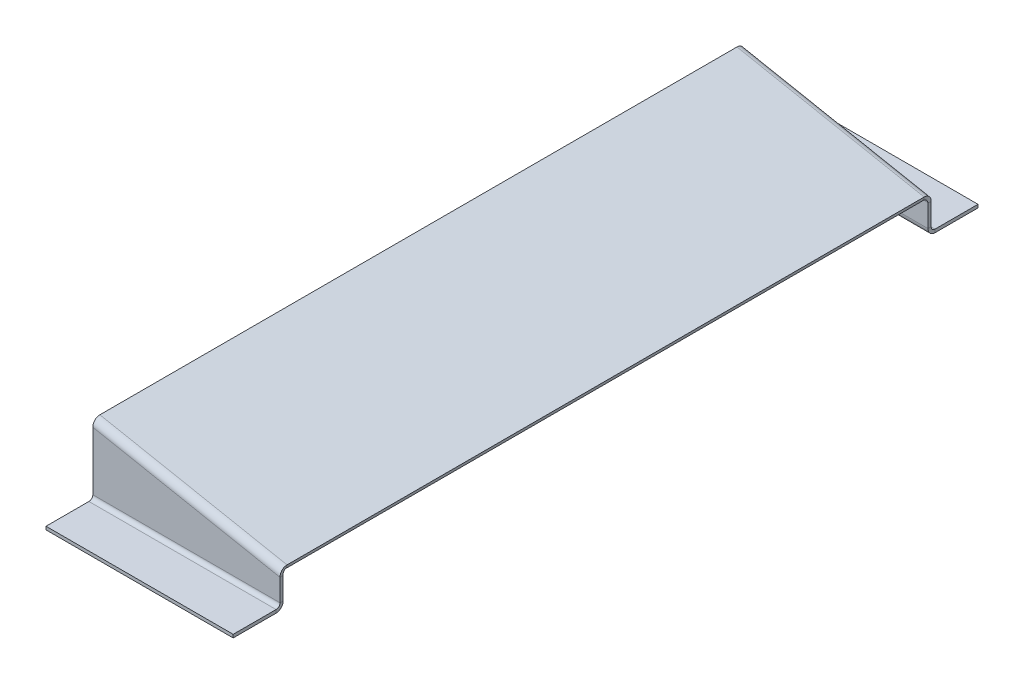
ISO-10303-21;
HEADER;
FILE_DESCRIPTION(('STEP AP214'),'2;1');
FILE_NAME('part.step','',(''),(''),'','','');
FILE_SCHEMA(('AUTOMOTIVE_DESIGN { 1 0 10303 214 1 1 1 1 }'));
ENDSEC;
DATA;
#1=APPLICATION_CONTEXT('core data for automotive mechanical design processes');
#2=APPLICATION_PROTOCOL_DEFINITION('international standard','automotive_design',2000,#1);
#3=PRODUCT_CONTEXT('',#1,'mechanical');
#4=PRODUCT('Part','Part','',(#3));
#5=PRODUCT_RELATED_PRODUCT_CATEGORY('part','',(#4));
#6=PRODUCT_DEFINITION_FORMATION('','',#4);
#7=PRODUCT_DEFINITION_CONTEXT('part definition',#1,'design');
#8=PRODUCT_DEFINITION('design','',#6,#7);
#9=PRODUCT_DEFINITION_SHAPE('','',#8);
#10=(LENGTH_UNIT() NAMED_UNIT(*) SI_UNIT(.MILLI.,.METRE.));
#11=(NAMED_UNIT(*) PLANE_ANGLE_UNIT() SI_UNIT($,.RADIAN.));
#12=(NAMED_UNIT(*) SI_UNIT($,.STERADIAN.) SOLID_ANGLE_UNIT());
#13=UNCERTAINTY_MEASURE_WITH_UNIT(LENGTH_MEASURE(1.E-05),#10,'distance_accuracy_value','');
#14=(GEOMETRIC_REPRESENTATION_CONTEXT(3) GLOBAL_UNCERTAINTY_ASSIGNED_CONTEXT((#13)) GLOBAL_UNIT_ASSIGNED_CONTEXT((#10,
#11,#12)) REPRESENTATION_CONTEXT('',''));
#15=CARTESIAN_POINT('',(0.,0.,0.));
#16=DIRECTION('',(0.,0.,1.));
#17=DIRECTION('',(1.,0.,0.));
#18=AXIS2_PLACEMENT_3D('',#15,#16,#17);
#19=CARTESIAN_POINT('',(-304.8,59.2471182251768,-265.1125));
#20=DIRECTION('',(-1.,0.,0.));
#21=DIRECTION('',(0.,-1.,0.));
#22=AXIS2_PLACEMENT_3D('',#19,#20,#21);
#23=PLANE('',#22);
#24=DIRECTION('',(0.,0.,-1.));
#25=VECTOR('',#24,1.);
#26=CARTESIAN_POINT('',(-304.8,5.7632600000001,-265.1125));
#27=LINE('',#26,#25);
#28=CARTESIAN_POINT('',(-304.8,5.76326000000009,-262.52424));
#29=VERTEX_POINT('',#28);
#30=CARTESIAN_POINT('',(-304.8,5.7632600000001,-265.1125));
#31=VERTEX_POINT('',#30);
#32=EDGE_CURVE('E11',#29,#31,#27,.T.);
#33=ORIENTED_EDGE('',*,*,#32,.F.);
#34=DIRECTION('',(0.,1.,0.));
#35=VECTOR('',#34,1.);
#36=CARTESIAN_POINT('',(-304.8,0.,-262.52424));
#37=LINE('',#36,#35);
#38=CARTESIAN_POINT('',(-304.8,53.3759890458092,-262.52424));
#39=VERTEX_POINT('',#38);
#40=EDGE_CURVE('E123',#39,#29,#37,.F.);
#41=ORIENTED_EDGE('',*,*,#40,.F.);
#42=DIRECTION('',(0.,0.,-1.));
#43=VECTOR('',#42,1.);
#44=CARTESIAN_POINT('',(-304.8,53.3759890458092,-265.1125));
#45=LINE('',#44,#43);
#46=CARTESIAN_POINT('',(-304.8,53.3759890458092,-265.1125));
#47=VERTEX_POINT('',#46);
#48=EDGE_CURVE('E47',#39,#47,#45,.T.);
#49=ORIENTED_EDGE('',*,*,#48,.T.);
#50=DIRECTION('',(0.,-1.,0.));
#51=VECTOR('',#50,1.);
#52=CARTESIAN_POINT('',(-304.8,59.2471182251768,-265.1125));
#53=LINE('',#52,#51);
#54=EDGE_CURVE('E126',#47,#31,#53,.T.);
#55=ORIENTED_EDGE('',*,*,#54,.T.);
#56=EDGE_LOOP('',(#33,#41,#49,#55));
#57=FACE_BOUND('',#56,.T.);
#58=ADVANCED_FACE('F37',(#57),#23,.T.);
#59=CARTESIAN_POINT('',(-304.8,47.5048598664417,-259.34924));
#60=CARTESIAN_POINT('',(-304.635378903209,48.3517619910518,-259.34924));
#61=CARTESIAN_POINT('',(-304.470757806418,49.1986641156618,-259.34924));
#62=CARTESIAN_POINT('',(-304.306136709627,50.0455662402719,-259.34924));
#63=CARTESIAN_POINT('',(-304.8,47.5048598664417,-270.87576));
#64=CARTESIAN_POINT('',(-304.635378903209,48.3517619910518,-269.150253333333));
#65=CARTESIAN_POINT('',(-304.470757806418,49.1986641156619,-267.424746666667));
#66=CARTESIAN_POINT('',(-304.306136709627,50.0455662402719,-265.69924));
#67=CARTESIAN_POINT('',(-304.8,59.2471182251768,-270.87576));
#68=CARTESIAN_POINT('',(-304.964621096791,58.4002161005668,-269.150253333333));
#69=CARTESIAN_POINT('',(-305.129242193582,57.5533139759567,-267.424746666667));
#70=CARTESIAN_POINT('',(-305.293863290373,56.7064118513466,-265.69924));
#71=CARTESIAN_POINT('',(-304.8,59.2471182251768,-259.34924));
#72=CARTESIAN_POINT('',(-304.964621096791,58.4002161005668,-259.34924));
#73=CARTESIAN_POINT('',(-305.129242193582,57.5533139759567,-259.34924));
#74=CARTESIAN_POINT('',(-305.293863290373,56.7064118513466,-259.34924));
#75=CARTESIAN_POINT('',(-304.8,59.2471182251768,-247.82272));
#76=CARTESIAN_POINT('',(-304.964621096791,58.4002161005668,-249.548226666667));
#77=CARTESIAN_POINT('',(-305.129242193582,57.5533139759567,-251.273733333333));
#78=CARTESIAN_POINT('',(-305.293863290373,56.7064118513466,-252.99924));
#79=CARTESIAN_POINT('',(-304.8,47.5048598664417,-247.82272));
#80=CARTESIAN_POINT('',(-304.635378903209,48.3517619910518,-249.548226666667));
#81=CARTESIAN_POINT('',(-304.470757806418,49.1986641156619,-251.273733333333));
#82=CARTESIAN_POINT('',(-304.306136709627,50.0455662402719,-252.99924));
#83=CARTESIAN_POINT('',(-304.8,47.5048598664417,-259.34924));
#84=CARTESIAN_POINT('',(-304.635378903209,48.3517619910518,-259.34924));
#85=CARTESIAN_POINT('',(-304.470757806418,49.1986641156618,-259.34924));
#86=CARTESIAN_POINT('',(-304.306136709627,50.0455662402719,-259.34924));
#87=(BOUNDED_SURFACE() B_SPLINE_SURFACE(3,3,((#59,#60,#61,#62),(#63,#64,#65,#66),(#67,#68,#69,
#70),(#71,#72,#73,#74),(#75,#76,#77,#78),(#79,#80,#81,#82),(#83,#84,#85,#86)),.UNSPECIFIED.,.T.,
.F.,.F.) B_SPLINE_SURFACE_WITH_KNOTS((4,3,4),(4,4),(0.,0.5,1.),(0.,1.),
.UNSPECIFIED.) GEOMETRIC_REPRESENTATION_ITEM() RATIONAL_B_SPLINE_SURFACE(((1.,1.,1.,1.),
(0.333333333333333,0.333333333333333,0.333333333333333,0.333333333333333),(0.333333333333333,
0.333333333333333,0.333333333333333,0.333333333333333),(1.,1.,1.,1.),(0.333333333333333,
0.333333333333333,0.333333333333333,0.333333333333333),(0.333333333333333,0.333333333333333,
0.333333333333333,0.333333333333333),(1.,1.,1.,1.))) REPRESENTATION_ITEM('') SURFACE());
#88=CARTESIAN_POINT('',(-304.8,53.3759890458093,-259.34924));
#89=DIRECTION('',(-0.989183331615166,-0.146684479256399,0.));
#90=DIRECTION('',(0.146684479256399,-0.989183331615166,0.));
#91=AXIS2_PLACEMENT_3D('',#88,#89,#90);
#92=ELLIPSE('',#91,3.36684080604081,3.175);
#93=CARTESIAN_POINT('',(-305.293863290373,56.7064118513466,-259.34924));
#94=VERTEX_POINT('',#93);
#95=EDGE_CURVE('E164',#39,#94,#92,.F.);
#96=DIRECTION('',(0.190808995376545,0.981627183447664,0.));
#97=VECTOR('',#96,1.);
#98=CARTESIAN_POINT('',(-304.8,59.2471182251768,-259.34924));
#99=LINE('',#98,#97);
#100=CARTESIAN_POINT('',(-304.8,59.2471182251768,-259.34924));
#101=VERTEX_POINT('',#100);
#102=EDGE_CURVE('E213',#94,#101,#99,.T.);
#103=CARTESIAN_POINT('',(-304.8,53.3759890458093,-259.34924));
#104=DIRECTION('',(-1.,0.,0.));
#105=DIRECTION('',(0.,-1.,0.));
#106=AXIS2_PLACEMENT_3D('',#103,#104,#105);
#107=ELLIPSE('',#106,5.87112917936759,5.76326);
#108=EDGE_CURVE('E235',#47,#101,#107,.F.);
#109=ORIENTED_EDGE('',*,*,#48,.F.);
#110=ORIENTED_EDGE('',*,*,#95,.T.);
#111=ORIENTED_EDGE('',*,*,#102,.T.);
#112=ORIENTED_EDGE('',*,*,#108,.F.);
#113=EDGE_LOOP('',(#109,#110,#111,#112));
#114=FACE_BOUND('',#113,.T.);
#115=ADVANCED_FACE('F236',(#114),#87,.F.);
#116=CARTESIAN_POINT('',(-304.8,59.2471182251768,265.1125));
#117=DIRECTION('',(-0.981627183447664,0.190808995376545,0.));
#118=DIRECTION('',(0.,0.,-1.));
#119=AXIS2_PLACEMENT_3D('',#116,#117,#118);
#120=PLANE('',#119);
#121=ORIENTED_EDGE('',*,*,#102,.F.);
#122=DIRECTION('',(0.,0.,1.));
#123=VECTOR('',#122,1.);
#124=CARTESIAN_POINT('',(-305.293863290373,56.7064118513466,0.));
#125=LINE('',#124,#123);
#126=CARTESIAN_POINT('',(-305.293863290373,56.7064118513465,259.34924));
#127=VERTEX_POINT('',#126);
#128=EDGE_CURVE('E315',#127,#94,#125,.F.);
#129=ORIENTED_EDGE('',*,*,#128,.F.);
#130=DIRECTION('',(0.190808995376562,0.981627183447661,0.));
#131=VECTOR('',#130,1.);
#132=CARTESIAN_POINT('',(-304.8,59.2471182251768,259.34924));
#133=LINE('',#132,#131);
#134=CARTESIAN_POINT('',(-304.8,59.2471182251768,259.34924));
#135=VERTEX_POINT('',#134);
#136=EDGE_CURVE('E210',#127,#135,#133,.T.);
#137=ORIENTED_EDGE('',*,*,#136,.T.);
#138=DIRECTION('',(0.,0.,-1.));
#139=VECTOR('',#138,1.);
#140=CARTESIAN_POINT('',(-304.8,59.2471182251768,265.1125));
#141=LINE('',#140,#139);
#142=EDGE_CURVE('E352',#135,#101,#141,.T.);
#143=ORIENTED_EDGE('',*,*,#142,.T.);
#144=EDGE_LOOP('',(#121,#129,#137,#143));
#145=FACE_BOUND('',#144,.T.);
#146=ADVANCED_FACE('F349',(#145),#120,.T.);
#147=CARTESIAN_POINT('',(-304.8,47.5048598664416,259.34924));
#148=CARTESIAN_POINT('',(-304.635378903209,48.3517619910517,259.34924));
#149=CARTESIAN_POINT('',(-304.470757806418,49.1986641156618,259.34924));
#150=CARTESIAN_POINT('',(-304.306136709627,50.0455662402718,259.34924));
#151=CARTESIAN_POINT('',(-304.8,47.5048598664416,247.82272));
#152=CARTESIAN_POINT('',(-304.635378903209,48.3517619910517,249.548226666667));
#153=CARTESIAN_POINT('',(-304.470757806418,49.1986641156618,251.273733333333));
#154=CARTESIAN_POINT('',(-304.306136709627,50.0455662402718,252.99924));
#155=CARTESIAN_POINT('',(-304.8,59.2471182251768,247.82272));
#156=CARTESIAN_POINT('',(-304.964621096791,58.4002161005667,249.548226666667));
#157=CARTESIAN_POINT('',(-305.129242193582,57.5533139759566,251.273733333333));
#158=CARTESIAN_POINT('',(-305.293863290373,56.7064118513465,252.99924));
#159=CARTESIAN_POINT('',(-304.8,59.2471182251768,259.34924));
#160=CARTESIAN_POINT('',(-304.964621096791,58.4002161005667,259.34924));
#161=CARTESIAN_POINT('',(-305.129242193582,57.5533139759566,259.34924));
#162=CARTESIAN_POINT('',(-305.293863290373,56.7064118513465,259.34924));
#163=CARTESIAN_POINT('',(-304.8,59.2471182251768,270.87576));
#164=CARTESIAN_POINT('',(-304.964621096791,58.4002161005667,269.150253333333));
#165=CARTESIAN_POINT('',(-305.129242193582,57.5533139759566,267.424746666667));
#166=CARTESIAN_POINT('',(-305.293863290373,56.7064118513465,265.69924));
#167=CARTESIAN_POINT('',(-304.8,47.5048598664416,270.87576));
#168=CARTESIAN_POINT('',(-304.635378903209,48.3517619910517,269.150253333333));
#169=CARTESIAN_POINT('',(-304.470757806418,49.1986641156618,267.424746666667));
#170=CARTESIAN_POINT('',(-304.306136709627,50.0455662402718,265.69924));
#171=CARTESIAN_POINT('',(-304.8,47.5048598664416,259.34924));
#172=CARTESIAN_POINT('',(-304.635378903209,48.3517619910517,259.34924));
#173=CARTESIAN_POINT('',(-304.470757806418,49.1986641156618,259.34924));
#174=CARTESIAN_POINT('',(-304.306136709627,50.0455662402718,259.34924));
#175=(BOUNDED_SURFACE() B_SPLINE_SURFACE(3,3,((#147,#148,#149,#150),(#151,#152,#153,#154),(#155,
#156,#157,#158),(#159,#160,#161,#162),(#163,#164,#165,#166),(#167,#168,#169,#170),(#171,#172,
#173,#174)),.UNSPECIFIED.,.T.,.F.,.F.) B_SPLINE_SURFACE_WITH_KNOTS((4,3,4),(4,4),(0.,0.5,1.),
(0.,1.),.UNSPECIFIED.) GEOMETRIC_REPRESENTATION_ITEM() RATIONAL_B_SPLINE_SURFACE(((1.,1.,1.,1.),
(0.333333333333333,0.333333333333333,0.333333333333333,0.333333333333333),(0.333333333333333,
0.333333333333333,0.333333333333333,0.333333333333333),(1.,1.,1.,1.),(0.333333333333333,
0.333333333333333,0.333333333333333,0.333333333333333),(0.333333333333333,0.333333333333333,
0.333333333333333,0.333333333333333),(1.,1.,1.,1.))) REPRESENTATION_ITEM('') SURFACE());
#176=CARTESIAN_POINT('',(-304.8,53.3759890458092,259.34924));
#177=DIRECTION('',(-0.989183331615166,-0.1466844792564,0.));
#178=DIRECTION('',(0.1466844792564,-0.989183331615166,0.));
#179=AXIS2_PLACEMENT_3D('',#176,#177,#178);
#180=ELLIPSE('',#179,3.36684080604081,3.175);
#181=CARTESIAN_POINT('',(-304.8,53.3759890458092,262.52424));
#182=VERTEX_POINT('',#181);
#183=EDGE_CURVE('E312',#127,#182,#180,.F.);
#184=DIRECTION('',(0.,0.,1.));
#185=VECTOR('',#184,1.);
#186=CARTESIAN_POINT('',(-304.8,53.3759890458092,265.1125));
#187=LINE('',#186,#185);
#188=CARTESIAN_POINT('',(-304.8,53.3759890458092,265.1125));
#189=VERTEX_POINT('',#188);
#190=EDGE_CURVE('E207',#182,#189,#187,.T.);
#191=CARTESIAN_POINT('',(-304.8,53.3759890458092,259.34924));
#192=DIRECTION('',(-1.,0.,0.));
#193=DIRECTION('',(0.,-1.,0.));
#194=AXIS2_PLACEMENT_3D('',#191,#192,#193);
#195=ELLIPSE('',#194,5.87112917936759,5.76326);
#196=EDGE_CURVE('E258',#135,#189,#195,.F.);
#197=ORIENTED_EDGE('',*,*,#136,.F.);
#198=ORIENTED_EDGE('',*,*,#183,.T.);
#199=ORIENTED_EDGE('',*,*,#190,.T.);
#200=ORIENTED_EDGE('',*,*,#196,.F.);
#201=EDGE_LOOP('',(#197,#198,#199,#200));
#202=FACE_BOUND('',#201,.T.);
#203=ADVANCED_FACE('F484',(#202),#175,.F.);
#204=CARTESIAN_POINT('',(-304.8,2.58826,265.1125));
#205=DIRECTION('',(-1.,0.,0.));
#206=DIRECTION('',(0.,1.,0.));
#207=AXIS2_PLACEMENT_3D('',#204,#205,#206);
#208=PLANE('',#207);
#209=ORIENTED_EDGE('',*,*,#190,.F.);
#210=DIRECTION('',(0.,1.,0.));
#211=VECTOR('',#210,1.);
#212=CARTESIAN_POINT('',(-304.8,0.,262.52424));
#213=LINE('',#212,#211);
#214=CARTESIAN_POINT('',(-304.8,5.76326,262.52424));
#215=VERTEX_POINT('',#214);
#216=EDGE_CURVE('E323',#215,#182,#213,.T.);
#217=ORIENTED_EDGE('',*,*,#216,.F.);
#218=DIRECTION('',(0.,0.,1.));
#219=VECTOR('',#218,1.);
#220=CARTESIAN_POINT('',(-304.8,5.76326,265.1125));
#221=LINE('',#220,#219);
#222=CARTESIAN_POINT('',(-304.8,5.76326,265.1125));
#223=VERTEX_POINT('',#222);
#224=EDGE_CURVE('E204',#215,#223,#221,.T.);
#225=ORIENTED_EDGE('',*,*,#224,.T.);
#226=DIRECTION('',(0.,1.,0.));
#227=VECTOR('',#226,1.);
#228=CARTESIAN_POINT('',(-304.8,2.58826,265.1125));
#229=LINE('',#228,#227);
#230=EDGE_CURVE('E378',#223,#189,#229,.T.);
#231=ORIENTED_EDGE('',*,*,#230,.T.);
#232=EDGE_LOOP('',(#209,#217,#225,#231));
#233=FACE_BOUND('',#232,.T.);
#234=ADVANCED_FACE('F377',(#233),#208,.T.);
#235=CARTESIAN_POINT('',(-304.8,5.76326,268.2875));
#236=DIRECTION('',(-1.,0.,0.));
#237=DIRECTION('',(0.,0.,1.));
#238=AXIS2_PLACEMENT_3D('',#235,#236,#237);
#239=PLANE('',#238);
#240=ORIENTED_EDGE('',*,*,#224,.F.);
#241=CARTESIAN_POINT('',(-304.8,5.76326,268.2875));
#242=DIRECTION('',(-1.,0.,0.));
#243=DIRECTION('',(0.,0.,1.));
#244=AXIS2_PLACEMENT_3D('',#241,#242,#243);
#245=CIRCLE('',#244,5.76326);
#246=CARTESIAN_POINT('',(-304.8,0.,268.2875));
#247=VERTEX_POINT('',#246);
#248=EDGE_CURVE('E319',#215,#247,#245,.T.);
#249=ORIENTED_EDGE('',*,*,#248,.T.);
#250=DIRECTION('',(0.,1.,0.));
#251=VECTOR('',#250,1.);
#252=CARTESIAN_POINT('',(-304.8,2.58826,268.2875));
#253=LINE('',#252,#251);
#254=CARTESIAN_POINT('',(-304.8,2.58826,268.2875));
#255=VERTEX_POINT('',#254);
#256=EDGE_CURVE('E202',#247,#255,#253,.T.);
#257=ORIENTED_EDGE('',*,*,#256,.T.);
#258=CARTESIAN_POINT('',(-304.8,5.76326,268.2875));
#259=DIRECTION('',(1.,0.,0.));
#260=DIRECTION('',(0.,0.,-1.));
#261=AXIS2_PLACEMENT_3D('',#258,#259,#260);
#262=CIRCLE('',#261,3.175);
#263=EDGE_CURVE('E269',#223,#255,#262,.F.);
#264=ORIENTED_EDGE('',*,*,#263,.F.);
#265=EDGE_LOOP('',(#240,#249,#257,#264));
#266=FACE_BOUND('',#265,.T.);
#267=ADVANCED_FACE('F389',(#266),#239,.T.);
#268=CARTESIAN_POINT('',(-304.8,2.58826,303.2125));
#269=DIRECTION('',(-1.,0.,0.));
#270=DIRECTION('',(0.,0.,-1.));
#271=AXIS2_PLACEMENT_3D('',#268,#269,#270);
#272=PLANE('',#271);
#273=ORIENTED_EDGE('',*,*,#256,.F.);
#274=DIRECTION('',(0.,0.,-1.));
#275=VECTOR('',#274,1.);
#276=CARTESIAN_POINT('',(-304.8,0.,0.));
#277=LINE('',#276,#275);
#278=CARTESIAN_POINT('',(-304.8,0.,303.2125));
#279=VERTEX_POINT('',#278);
#280=EDGE_CURVE('E159',#279,#247,#277,.T.);
#281=ORIENTED_EDGE('',*,*,#280,.F.);
#282=DIRECTION('',(0.,1.,0.));
#283=VECTOR('',#282,1.);
#284=CARTESIAN_POINT('',(-304.8,2.58826,303.2125));
#285=LINE('',#284,#283);
#286=CARTESIAN_POINT('',(-304.8,2.58826,303.2125));
#287=VERTEX_POINT('',#286);
#288=EDGE_CURVE('E199',#279,#287,#285,.T.);
#289=ORIENTED_EDGE('',*,*,#288,.T.);
#290=DIRECTION('',(0.,0.,-1.));
#291=VECTOR('',#290,1.);
#292=CARTESIAN_POINT('',(-304.8,2.58826,303.2125));
#293=LINE('',#292,#291);
#294=EDGE_CURVE('E403',#287,#255,#293,.T.);
#295=ORIENTED_EDGE('',*,*,#294,.T.);
#296=EDGE_LOOP('',(#273,#281,#289,#295));
#297=FACE_BOUND('',#296,.T.);
#298=ADVANCED_FACE('F499',(#297),#272,.T.);
#299=CARTESIAN_POINT('',(-304.8,2.58826,303.2125));
#300=DIRECTION('',(0.,0.,-1.));
#301=DIRECTION('',(1.,0.,0.));
#302=AXIS2_PLACEMENT_3D('',#299,#300,#301);
#303=PLANE('',#302);
#304=ORIENTED_EDGE('',*,*,#288,.F.);
#305=DIRECTION('',(1.,0.,0.));
#306=VECTOR('',#305,1.);
#307=CARTESIAN_POINT('',(0.,0.,303.2125));
#308=LINE('',#307,#306);
#309=CARTESIAN_POINT('',(-152.4,0.,303.2125));
#310=VERTEX_POINT('',#309);
#311=EDGE_CURVE('E162',#279,#310,#308,.T.);
#312=ORIENTED_EDGE('',*,*,#311,.T.);
#313=DIRECTION('',(0.,1.,0.));
#314=VECTOR('',#313,1.);
#315=CARTESIAN_POINT('',(-152.4,2.58826,303.2125));
#316=LINE('',#315,#314);
#317=CARTESIAN_POINT('',(-152.4,2.58826,303.2125));
#318=VERTEX_POINT('',#317);
#319=EDGE_CURVE('E196',#310,#318,#316,.T.);
#320=ORIENTED_EDGE('',*,*,#319,.T.);
#321=DIRECTION('',(1.,0.,0.));
#322=VECTOR('',#321,1.);
#323=CARTESIAN_POINT('',(-304.8,2.58826,303.2125));
#324=LINE('',#323,#322);
#325=EDGE_CURVE('E405',#287,#318,#324,.T.);
#326=ORIENTED_EDGE('',*,*,#325,.F.);
#327=EDGE_LOOP('',(#304,#312,#320,#326));
#328=FACE_BOUND('',#327,.T.);
#329=ADVANCED_FACE('F502',(#328),#303,.F.);
#330=CARTESIAN_POINT('',(-152.4,2.58826,303.2125));
#331=DIRECTION('',(-1.,0.,0.));
#332=DIRECTION('',(0.,0.,-1.));
#333=AXIS2_PLACEMENT_3D('',#330,#331,#332);
#334=PLANE('',#333);
#335=ORIENTED_EDGE('',*,*,#319,.F.);
#336=DIRECTION('',(0.,0.,-1.));
#337=VECTOR('',#336,1.);
#338=CARTESIAN_POINT('',(-152.4,0.,0.));
#339=LINE('',#338,#337);
#340=CARTESIAN_POINT('',(-152.4,0.,268.2875));
#341=VERTEX_POINT('',#340);
#342=EDGE_CURVE('E327',#310,#341,#339,.T.);
#343=ORIENTED_EDGE('',*,*,#342,.T.);
#344=DIRECTION('',(0.,1.,0.));
#345=VECTOR('',#344,1.);
#346=CARTESIAN_POINT('',(-152.4,2.58826,268.2875));
#347=LINE('',#346,#345);
#348=CARTESIAN_POINT('',(-152.4,2.58826,268.2875));
#349=VERTEX_POINT('',#348);
#350=EDGE_CURVE('E55',#341,#349,#347,.T.);
#351=ORIENTED_EDGE('',*,*,#350,.T.);
#352=DIRECTION('',(0.,0.,-1.));
#353=VECTOR('',#352,1.);
#354=CARTESIAN_POINT('',(-152.4,2.58826,303.2125));
#355=LINE('',#354,#353);
#356=EDGE_CURVE('E387',#318,#349,#355,.T.);
#357=ORIENTED_EDGE('',*,*,#356,.F.);
#358=EDGE_LOOP('',(#335,#343,#351,#357));
#359=FACE_BOUND('',#358,.T.);
#360=ADVANCED_FACE('F506',(#359),#334,.F.);
#361=CARTESIAN_POINT('',(-152.4,5.76326,268.2875));
#362=DIRECTION('',(1.,0.,0.));
#363=DIRECTION('',(0.,0.,-1.));
#364=AXIS2_PLACEMENT_3D('',#361,#362,#363);
#365=PLANE('',#364);
#366=ORIENTED_EDGE('',*,*,#350,.F.);
#367=CARTESIAN_POINT('',(-152.4,5.76326,268.2875));
#368=DIRECTION('',(-1.,0.,0.));
#369=DIRECTION('',(0.,0.,1.));
#370=AXIS2_PLACEMENT_3D('',#367,#368,#369);
#371=CIRCLE('',#370,5.76326);
#372=CARTESIAN_POINT('',(-152.4,5.76326,262.52424));
#373=VERTEX_POINT('',#372);
#374=EDGE_CURVE('E324',#341,#373,#371,.F.);
#375=ORIENTED_EDGE('',*,*,#374,.T.);
#376=DIRECTION('',(0.,0.,1.));
#377=VECTOR('',#376,1.);
#378=CARTESIAN_POINT('',(-152.4,5.76326,265.1125));
#379=LINE('',#378,#377);
#380=CARTESIAN_POINT('',(-152.4,5.76326,265.1125));
#381=VERTEX_POINT('',#380);
#382=EDGE_CURVE('E192',#373,#381,#379,.T.);
#383=ORIENTED_EDGE('',*,*,#382,.T.);
#384=CARTESIAN_POINT('',(-152.4,5.76326,268.2875));
#385=DIRECTION('',(-1.,0.,0.));
#386=DIRECTION('',(0.,0.,1.));
#387=AXIS2_PLACEMENT_3D('',#384,#385,#386);
#388=CIRCLE('',#387,3.175);
#389=EDGE_CURVE('E277',#349,#381,#388,.F.);
#390=ORIENTED_EDGE('',*,*,#389,.F.);
#391=EDGE_LOOP('',(#366,#375,#383,#390));
#392=FACE_BOUND('',#391,.T.);
#393=ADVANCED_FACE('F510',(#392),#365,.T.);
#394=CARTESIAN_POINT('',(-152.4,2.58826,265.1125));
#395=DIRECTION('',(-1.,0.,0.));
#396=DIRECTION('',(0.,1.,0.));
#397=AXIS2_PLACEMENT_3D('',#394,#395,#396);
#398=PLANE('',#397);
#399=ORIENTED_EDGE('',*,*,#382,.F.);
#400=DIRECTION('',(0.,1.,0.));
#401=VECTOR('',#400,1.);
#402=CARTESIAN_POINT('',(-152.4,0.,262.52424));
#403=LINE('',#402,#401);
#404=CARTESIAN_POINT('',(-152.4,23.7524299332208,262.52424));
#405=VERTEX_POINT('',#404);
#406=EDGE_CURVE('E320',#373,#405,#403,.T.);
#407=ORIENTED_EDGE('',*,*,#406,.T.);
#408=DIRECTION('',(0.,0.,1.));
#409=VECTOR('',#408,1.);
#410=CARTESIAN_POINT('',(-152.4,23.7524299332208,265.1125));
#411=LINE('',#410,#409);
#412=CARTESIAN_POINT('',(-152.4,23.7524299332208,265.1125));
#413=VERTEX_POINT('',#412);
#414=EDGE_CURVE('E189',#405,#413,#411,.T.);
#415=ORIENTED_EDGE('',*,*,#414,.T.);
#416=DIRECTION('',(0.,1.,0.));
#417=VECTOR('',#416,1.);
#418=CARTESIAN_POINT('',(-152.4,2.58826,265.1125));
#419=LINE('',#418,#417);
#420=EDGE_CURVE('E357',#381,#413,#419,.T.);
#421=ORIENTED_EDGE('',*,*,#420,.F.);
#422=EDGE_LOOP('',(#399,#407,#415,#421));
#423=FACE_BOUND('',#422,.T.);
#424=ADVANCED_FACE('F398',(#423),#398,.F.);
#425=CARTESIAN_POINT('',(-152.4,17.8813007538532,259.34924));
#426=CARTESIAN_POINT('',(-152.235378903209,18.7282028784633,259.34924));
#427=CARTESIAN_POINT('',(-152.070757806418,19.5751050030734,259.34924));
#428=CARTESIAN_POINT('',(-151.906136709627,20.4220071276835,259.34924));
#429=CARTESIAN_POINT('',(-152.4,17.8813007538532,270.87576));
#430=CARTESIAN_POINT('',(-152.235378903209,18.7282028784633,269.150253333333));
#431=CARTESIAN_POINT('',(-152.070757806418,19.5751050030734,267.424746666667));
#432=CARTESIAN_POINT('',(-151.906136709627,20.4220071276835,265.69924));
#433=CARTESIAN_POINT('',(-152.4,29.6235591125884,270.87576));
#434=CARTESIAN_POINT('',(-152.564621096791,28.7766569879783,269.150253333333));
#435=CARTESIAN_POINT('',(-152.729242193582,27.9297548633682,267.424746666667));
#436=CARTESIAN_POINT('',(-152.893863290373,27.0828527387581,265.69924));
#437=CARTESIAN_POINT('',(-152.4,29.6235591125884,259.34924));
#438=CARTESIAN_POINT('',(-152.564621096791,28.7766569879783,259.34924));
#439=CARTESIAN_POINT('',(-152.729242193582,27.9297548633682,259.34924));
#440=CARTESIAN_POINT('',(-152.893863290373,27.0828527387581,259.34924));
#441=CARTESIAN_POINT('',(-152.4,29.6235591125884,247.82272));
#442=CARTESIAN_POINT('',(-152.564621096791,28.7766569879783,249.548226666667));
#443=CARTESIAN_POINT('',(-152.729242193582,27.9297548633682,251.273733333333));
#444=CARTESIAN_POINT('',(-152.893863290373,27.0828527387581,252.99924));
#445=CARTESIAN_POINT('',(-152.4,17.8813007538532,247.82272));
#446=CARTESIAN_POINT('',(-152.235378903209,18.7282028784633,249.548226666667));
#447=CARTESIAN_POINT('',(-152.070757806418,19.5751050030734,251.273733333333));
#448=CARTESIAN_POINT('',(-151.906136709627,20.4220071276835,252.99924));
#449=CARTESIAN_POINT('',(-152.4,17.8813007538532,259.34924));
#450=CARTESIAN_POINT('',(-152.235378903209,18.7282028784633,259.34924));
#451=CARTESIAN_POINT('',(-152.070757806418,19.5751050030734,259.34924));
#452=CARTESIAN_POINT('',(-151.906136709627,20.4220071276835,259.34924));
#453=(BOUNDED_SURFACE() B_SPLINE_SURFACE(3,3,((#425,#426,#427,#428),(#429,#430,#431,#432),(#433,
#434,#435,#436),(#437,#438,#439,#440),(#441,#442,#443,#444),(#445,#446,#447,#448),(#449,#450,
#451,#452)),.UNSPECIFIED.,.T.,.F.,.F.) B_SPLINE_SURFACE_WITH_KNOTS((4,3,4),(4,4),(0.,0.5,1.),
(0.,1.),.UNSPECIFIED.) GEOMETRIC_REPRESENTATION_ITEM() RATIONAL_B_SPLINE_SURFACE(((1.,1.,1.,1.),
(0.333333333333333,0.333333333333333,0.333333333333333,0.333333333333333),(0.333333333333333,
0.333333333333333,0.333333333333333,0.333333333333333),(1.,1.,1.,1.),(0.333333333333333,
0.333333333333333,0.333333333333333,0.333333333333333),(0.333333333333333,0.333333333333333,
0.333333333333333,0.333333333333333),(1.,1.,1.,1.))) REPRESENTATION_ITEM('') SURFACE());
#454=CARTESIAN_POINT('',(-152.4,23.7524299332208,259.34924));
#455=DIRECTION('',(0.989183331615165,0.146684479256403,0.));
#456=DIRECTION('',(0.146684479256403,-0.989183331615165,0.));
#457=AXIS2_PLACEMENT_3D('',#454,#455,#456);
#458=ELLIPSE('',#457,3.36684080604081,3.175);
#459=CARTESIAN_POINT('',(-152.893863290373,27.0828527387581,259.34924));
#460=VERTEX_POINT('',#459);
#461=EDGE_CURVE('E316',#405,#460,#458,.F.);
#462=DIRECTION('',(0.190808995376545,0.981627183447664,0.));
#463=VECTOR('',#462,1.);
#464=CARTESIAN_POINT('',(-152.4,29.6235591125884,259.34924));
#465=LINE('',#464,#463);
#466=CARTESIAN_POINT('',(-152.4,29.6235591125884,259.34924));
#467=VERTEX_POINT('',#466);
#468=EDGE_CURVE('E186',#460,#467,#465,.T.);
#469=CARTESIAN_POINT('',(-152.4,23.7524299332208,259.34924));
#470=DIRECTION('',(1.,0.,0.));
#471=DIRECTION('',(0.,-1.,0.));
#472=AXIS2_PLACEMENT_3D('',#469,#470,#471);
#473=ELLIPSE('',#472,5.87112917936759,5.76326);
#474=EDGE_CURVE('E266',#413,#467,#473,.F.);
#475=ORIENTED_EDGE('',*,*,#414,.F.);
#476=ORIENTED_EDGE('',*,*,#461,.T.);
#477=ORIENTED_EDGE('',*,*,#468,.T.);
#478=ORIENTED_EDGE('',*,*,#474,.F.);
#479=EDGE_LOOP('',(#475,#476,#477,#478));
#480=FACE_BOUND('',#479,.T.);
#481=ADVANCED_FACE('F515',(#480),#453,.F.);
#482=CARTESIAN_POINT('',(-152.4,29.6235591125884,265.1125));
#483=DIRECTION('',(-0.981627183447664,0.190808995376545,0.));
#484=DIRECTION('',(0.,0.,-1.));
#485=AXIS2_PLACEMENT_3D('',#482,#483,#484);
#486=PLANE('',#485);
#487=ORIENTED_EDGE('',*,*,#468,.F.);
#488=DIRECTION('',(0.,0.,1.));
#489=VECTOR('',#488,1.);
#490=CARTESIAN_POINT('',(-152.893863290373,27.0828527387582,0.));
#491=LINE('',#490,#489);
#492=CARTESIAN_POINT('',(-152.893863290373,27.0828527387582,-259.34924));
#493=VERTEX_POINT('',#492);
#494=EDGE_CURVE('E154',#460,#493,#491,.F.);
#495=ORIENTED_EDGE('',*,*,#494,.T.);
#496=DIRECTION('',(0.190808995376552,0.981627183447663,0.));
#497=VECTOR('',#496,1.);
#498=CARTESIAN_POINT('',(-152.4,29.6235591125885,-259.34924));
#499=LINE('',#498,#497);
#500=CARTESIAN_POINT('',(-152.4,29.6235591125885,-259.34924));
#501=VERTEX_POINT('',#500);
#502=EDGE_CURVE('E183',#493,#501,#499,.T.);
#503=ORIENTED_EDGE('',*,*,#502,.T.);
#504=DIRECTION('',(0.,0.,-1.));
#505=VECTOR('',#504,1.);
#506=CARTESIAN_POINT('',(-152.4,29.6235591125884,265.1125));
#507=LINE('',#506,#505);
#508=EDGE_CURVE('E232',#467,#501,#507,.T.);
#509=ORIENTED_EDGE('',*,*,#508,.F.);
#510=EDGE_LOOP('',(#487,#495,#503,#509));
#511=FACE_BOUND('',#510,.T.);
#512=ADVANCED_FACE('F520',(#511),#486,.F.);
#513=CARTESIAN_POINT('',(-152.4,17.8813007538533,-259.34924));
#514=CARTESIAN_POINT('',(-152.235378903209,18.7282028784634,-259.34924));
#515=CARTESIAN_POINT('',(-152.070757806418,19.5751050030735,-259.34924));
#516=CARTESIAN_POINT('',(-151.906136709627,20.4220071276835,-259.34924));
#517=CARTESIAN_POINT('',(-152.4,17.8813007538533,-247.82272));
#518=CARTESIAN_POINT('',(-152.235378903209,18.7282028784634,-249.548226666667));
#519=CARTESIAN_POINT('',(-152.070757806418,19.5751050030735,-251.273733333333));
#520=CARTESIAN_POINT('',(-151.906136709627,20.4220071276835,-252.99924));
#521=CARTESIAN_POINT('',(-152.4,29.6235591125885,-247.82272));
#522=CARTESIAN_POINT('',(-152.564621096791,28.7766569879784,-249.548226666667));
#523=CARTESIAN_POINT('',(-152.729242193582,27.9297548633683,-251.273733333333));
#524=CARTESIAN_POINT('',(-152.893863290373,27.0828527387582,-252.99924));
#525=CARTESIAN_POINT('',(-152.4,29.6235591125885,-259.34924));
#526=CARTESIAN_POINT('',(-152.564621096791,28.7766569879784,-259.34924));
#527=CARTESIAN_POINT('',(-152.729242193582,27.9297548633683,-259.34924));
#528=CARTESIAN_POINT('',(-152.893863290373,27.0828527387582,-259.34924));
#529=CARTESIAN_POINT('',(-152.4,29.6235591125885,-270.87576));
#530=CARTESIAN_POINT('',(-152.564621096791,28.7766569879784,-269.150253333333));
#531=CARTESIAN_POINT('',(-152.729242193582,27.9297548633683,-267.424746666667));
#532=CARTESIAN_POINT('',(-152.893863290373,27.0828527387582,-265.69924));
#533=CARTESIAN_POINT('',(-152.4,17.8813007538533,-270.87576));
#534=CARTESIAN_POINT('',(-152.235378903209,18.7282028784634,-269.150253333333));
#535=CARTESIAN_POINT('',(-152.070757806418,19.5751050030735,-267.424746666667));
#536=CARTESIAN_POINT('',(-151.906136709627,20.4220071276835,-265.69924));
#537=CARTESIAN_POINT('',(-152.4,17.8813007538533,-259.34924));
#538=CARTESIAN_POINT('',(-152.235378903209,18.7282028784634,-259.34924));
#539=CARTESIAN_POINT('',(-152.070757806418,19.5751050030735,-259.34924));
#540=CARTESIAN_POINT('',(-151.906136709627,20.4220071276835,-259.34924));
#541=(BOUNDED_SURFACE() B_SPLINE_SURFACE(3,3,((#513,#514,#515,#516),(#517,#518,#519,#520),(#521,
#522,#523,#524),(#525,#526,#527,#528),(#529,#530,#531,#532),(#533,#534,#535,#536),(#537,#538,
#539,#540)),.UNSPECIFIED.,.T.,.F.,.F.) B_SPLINE_SURFACE_WITH_KNOTS((4,3,4),(4,4),(0.,0.5,1.),
(0.,1.),.UNSPECIFIED.) GEOMETRIC_REPRESENTATION_ITEM() RATIONAL_B_SPLINE_SURFACE(((1.,1.,1.,1.),
(0.333333333333333,0.333333333333333,0.333333333333333,0.333333333333333),(0.333333333333333,
0.333333333333333,0.333333333333333,0.333333333333333),(1.,1.,1.,1.),(0.333333333333333,
0.333333333333333,0.333333333333333,0.333333333333333),(0.333333333333333,0.333333333333333,
0.333333333333333,0.333333333333333),(1.,1.,1.,1.))) REPRESENTATION_ITEM('') SURFACE());
#542=CARTESIAN_POINT('',(-152.4,23.7524299332209,-259.34924));
#543=DIRECTION('',(0.989183331615165,0.146684479256403,0.));
#544=DIRECTION('',(0.146684479256403,-0.989183331615165,0.));
#545=AXIS2_PLACEMENT_3D('',#542,#543,#544);
#546=ELLIPSE('',#545,3.36684080604081,3.175);
#547=CARTESIAN_POINT('',(-152.4,23.7524299332209,-262.52424));
#548=VERTEX_POINT('',#547);
#549=EDGE_CURVE('E309',#493,#548,#546,.F.);
#550=DIRECTION('',(0.,0.,-1.));
#551=VECTOR('',#550,1.);
#552=CARTESIAN_POINT('',(-152.4,23.7524299332209,-265.1125));
#553=LINE('',#552,#551);
#554=CARTESIAN_POINT('',(-152.4,23.7524299332209,-265.1125));
#555=VERTEX_POINT('',#554);
#556=EDGE_CURVE('E180',#548,#555,#553,.T.);
#557=CARTESIAN_POINT('',(-152.4,23.7524299332209,-259.34924));
#558=DIRECTION('',(1.,0.,0.));
#559=DIRECTION('',(0.,-1.,0.));
#560=AXIS2_PLACEMENT_3D('',#557,#558,#559);
#561=ELLIPSE('',#560,5.87112917936759,5.76326);
#562=EDGE_CURVE('E241',#501,#555,#561,.F.);
#563=ORIENTED_EDGE('',*,*,#502,.F.);
#564=ORIENTED_EDGE('',*,*,#549,.T.);
#565=ORIENTED_EDGE('',*,*,#556,.T.);
#566=ORIENTED_EDGE('',*,*,#562,.F.);
#567=EDGE_LOOP('',(#563,#564,#565,#566));
#568=FACE_BOUND('',#567,.T.);
#569=ADVANCED_FACE('F435',(#568),#541,.F.);
#570=CARTESIAN_POINT('',(-152.4,29.6235591125885,-265.1125));
#571=DIRECTION('',(-1.,0.,0.));
#572=DIRECTION('',(0.,-1.,0.));
#573=AXIS2_PLACEMENT_3D('',#570,#571,#572);
#574=PLANE('',#573);
#575=ORIENTED_EDGE('',*,*,#556,.F.);
#576=DIRECTION('',(0.,1.,0.));
#577=VECTOR('',#576,1.);
#578=CARTESIAN_POINT('',(-152.4,0.,-262.52424));
#579=LINE('',#578,#577);
#580=CARTESIAN_POINT('',(-152.4,5.76326000000011,-262.52424));
#581=VERTEX_POINT('',#580);
#582=EDGE_CURVE('E153',#548,#581,#579,.F.);
#583=ORIENTED_EDGE('',*,*,#582,.T.);
#584=DIRECTION('',(0.,0.,-1.));
#585=VECTOR('',#584,1.);
#586=CARTESIAN_POINT('',(-152.4,5.76326000000011,-265.1125));
#587=LINE('',#586,#585);
#588=CARTESIAN_POINT('',(-152.4,5.76326000000011,-265.1125));
#589=VERTEX_POINT('',#588);
#590=EDGE_CURVE('E177',#581,#589,#587,.T.);
#591=ORIENTED_EDGE('',*,*,#590,.T.);
#592=DIRECTION('',(0.,-1.,0.));
#593=VECTOR('',#592,1.);
#594=CARTESIAN_POINT('',(-152.4,29.6235591125885,-265.1125));
#595=LINE('',#594,#593);
#596=EDGE_CURVE('E231',#555,#589,#595,.T.);
#597=ORIENTED_EDGE('',*,*,#596,.F.);
#598=EDGE_LOOP('',(#575,#583,#591,#597));
#599=FACE_BOUND('',#598,.T.);
#600=ADVANCED_FACE('F437',(#599),#574,.F.);
#601=CARTESIAN_POINT('',(-152.4,5.7632600000001,-268.2875));
#602=DIRECTION('',(1.,0.,0.));
#603=DIRECTION('',(0.,0.,-1.));
#604=AXIS2_PLACEMENT_3D('',#601,#602,#603);
#605=PLANE('',#604);
#606=ORIENTED_EDGE('',*,*,#590,.F.);
#607=CARTESIAN_POINT('',(-152.4,5.7632600000001,-268.2875));
#608=DIRECTION('',(-1.,0.,0.));
#609=DIRECTION('',(0.,0.,1.));
#610=AXIS2_PLACEMENT_3D('',#607,#608,#609);
#611=CIRCLE('',#610,5.76326);
#612=CARTESIAN_POINT('',(-152.4,0.,-268.2875));
#613=VERTEX_POINT('',#612);
#614=EDGE_CURVE('E142',#581,#613,#611,.F.);
#615=ORIENTED_EDGE('',*,*,#614,.T.);
#616=DIRECTION('',(0.,1.,0.));
#617=VECTOR('',#616,1.);
#618=CARTESIAN_POINT('',(-152.4,2.5882600000001,-268.2875));
#619=LINE('',#618,#617);
#620=CARTESIAN_POINT('',(-152.4,2.5882600000001,-268.2875));
#621=VERTEX_POINT('',#620);
#622=EDGE_CURVE('E174',#613,#621,#619,.T.);
#623=ORIENTED_EDGE('',*,*,#622,.T.);
#624=CARTESIAN_POINT('',(-152.4,5.7632600000001,-268.2875));
#625=DIRECTION('',(-1.,0.,0.));
#626=DIRECTION('',(0.,0.,1.));
#627=AXIS2_PLACEMENT_3D('',#624,#625,#626);
#628=CIRCLE('',#627,3.175);
#629=EDGE_CURVE('E240',#589,#621,#628,.F.);
#630=ORIENTED_EDGE('',*,*,#629,.F.);
#631=EDGE_LOOP('',(#606,#615,#623,#630));
#632=FACE_BOUND('',#631,.T.);
#633=ADVANCED_FACE('F460',(#632),#605,.T.);
#634=CARTESIAN_POINT('',(-152.4,2.5882600000001,-265.1125));
#635=DIRECTION('',(-1.,0.,0.));
#636=DIRECTION('',(0.,0.,-1.));
#637=AXIS2_PLACEMENT_3D('',#634,#635,#636);
#638=PLANE('',#637);
#639=ORIENTED_EDGE('',*,*,#622,.F.);
#640=DIRECTION('',(0.,0.,-1.));
#641=VECTOR('',#640,1.);
#642=CARTESIAN_POINT('',(-152.4,0.,0.));
#643=LINE('',#642,#641);
#644=CARTESIAN_POINT('',(-152.4,1.11311423041845E-13,-303.2125));
#645=VERTEX_POINT('',#644);
#646=EDGE_CURVE('E283',#613,#645,#643,.T.);
#647=ORIENTED_EDGE('',*,*,#646,.T.);
#648=DIRECTION('',(0.,1.,0.));
#649=VECTOR('',#648,1.);
#650=CARTESIAN_POINT('',(-152.4,2.58826000000011,-303.2125));
#651=LINE('',#650,#649);
#652=CARTESIAN_POINT('',(-152.4,2.58826000000011,-303.2125));
#653=VERTEX_POINT('',#652);
#654=EDGE_CURVE('E171',#645,#653,#651,.T.);
#655=ORIENTED_EDGE('',*,*,#654,.T.);
#656=DIRECTION('',(0.,0.,-1.));
#657=VECTOR('',#656,1.);
#658=CARTESIAN_POINT('',(-152.4,2.5882600000001,-265.1125));
#659=LINE('',#658,#657);
#660=EDGE_CURVE('E410',#621,#653,#659,.T.);
#661=ORIENTED_EDGE('',*,*,#660,.F.);
#662=EDGE_LOOP('',(#639,#647,#655,#661));
#663=FACE_BOUND('',#662,.T.);
#664=ADVANCED_FACE('F458',(#663),#638,.F.);
#665=CARTESIAN_POINT('',(-152.4,2.58826000000011,-303.2125));
#666=DIRECTION('',(0.,0.,1.));
#667=DIRECTION('',(-1.,0.,0.));
#668=AXIS2_PLACEMENT_3D('',#665,#666,#667);
#669=PLANE('',#668);
#670=ORIENTED_EDGE('',*,*,#654,.F.);
#671=DIRECTION('',(1.,0.,0.));
#672=VECTOR('',#671,1.);
#673=CARTESIAN_POINT('',(0.,1.11311423041845E-13,-303.2125));
#674=LINE('',#673,#672);
#675=CARTESIAN_POINT('',(-304.8,1.11311423041845E-13,-303.2125));
#676=VERTEX_POINT('',#675);
#677=EDGE_CURVE('E303',#645,#676,#674,.F.);
#678=ORIENTED_EDGE('',*,*,#677,.T.);
#679=DIRECTION('',(0.,1.,0.));
#680=VECTOR('',#679,1.);
#681=CARTESIAN_POINT('',(-304.8,2.58826000000011,-303.2125));
#682=LINE('',#681,#680);
#683=CARTESIAN_POINT('',(-304.8,2.58826000000011,-303.2125));
#684=VERTEX_POINT('',#683);
#685=EDGE_CURVE('E168',#676,#684,#682,.T.);
#686=ORIENTED_EDGE('',*,*,#685,.T.);
#687=DIRECTION('',(-1.,0.,0.));
#688=VECTOR('',#687,1.);
#689=CARTESIAN_POINT('',(-152.4,2.58826000000011,-303.2125));
#690=LINE('',#689,#688);
#691=EDGE_CURVE('E438',#653,#684,#690,.T.);
#692=ORIENTED_EDGE('',*,*,#691,.F.);
#693=EDGE_LOOP('',(#670,#678,#686,#692));
#694=FACE_BOUND('',#693,.T.);
#695=ADVANCED_FACE('F452',(#694),#669,.F.);
#696=CARTESIAN_POINT('',(-304.8,2.5882600000001,-265.1125));
#697=DIRECTION('',(-1.,0.,0.));
#698=DIRECTION('',(0.,0.,-1.));
#699=AXIS2_PLACEMENT_3D('',#696,#697,#698);
#700=PLANE('',#699);
#701=ORIENTED_EDGE('',*,*,#685,.F.);
#702=DIRECTION('',(0.,0.,-1.));
#703=VECTOR('',#702,1.);
#704=CARTESIAN_POINT('',(-304.8,0.,0.));
#705=LINE('',#704,#703);
#706=CARTESIAN_POINT('',(-304.8,0.,-268.2875));
#707=VERTEX_POINT('',#706);
#708=EDGE_CURVE('E300',#707,#676,#705,.T.);
#709=ORIENTED_EDGE('',*,*,#708,.F.);
#710=DIRECTION('',(0.,1.,0.));
#711=VECTOR('',#710,1.);
#712=CARTESIAN_POINT('',(-304.8,2.5882600000001,-268.2875));
#713=LINE('',#712,#711);
#714=CARTESIAN_POINT('',(-304.8,2.5882600000001,-268.2875));
#715=VERTEX_POINT('',#714);
#716=EDGE_CURVE('E41',#707,#715,#713,.T.);
#717=ORIENTED_EDGE('',*,*,#716,.T.);
#718=DIRECTION('',(0.,0.,-1.));
#719=VECTOR('',#718,1.);
#720=CARTESIAN_POINT('',(-304.8,2.5882600000001,-265.1125));
#721=LINE('',#720,#719);
#722=EDGE_CURVE('E441',#715,#684,#721,.T.);
#723=ORIENTED_EDGE('',*,*,#722,.T.);
#724=EDGE_LOOP('',(#701,#709,#717,#723));
#725=FACE_BOUND('',#724,.T.);
#726=ADVANCED_FACE('F446',(#725),#700,.T.);
#727=CARTESIAN_POINT('',(-304.8,5.7632600000001,-268.2875));
#728=DIRECTION('',(-1.,0.,0.));
#729=DIRECTION('',(0.,0.,1.));
#730=AXIS2_PLACEMENT_3D('',#727,#728,#729);
#731=PLANE('',#730);
#732=CARTESIAN_POINT('',(-304.8,5.7632600000001,-268.2875));
#733=DIRECTION('',(-1.,0.,0.));
#734=DIRECTION('',(0.,0.,1.));
#735=AXIS2_PLACEMENT_3D('',#732,#733,#734);
#736=CIRCLE('',#735,5.76326);
#737=EDGE_CURVE('E139',#707,#29,#736,.T.);
#738=ORIENTED_EDGE('',*,*,#737,.T.);
#739=ORIENTED_EDGE('',*,*,#32,.T.);
#740=CARTESIAN_POINT('',(-304.8,5.7632600000001,-268.2875));
#741=DIRECTION('',(1.,0.,0.));
#742=DIRECTION('',(0.,0.,-1.));
#743=AXIS2_PLACEMENT_3D('',#740,#741,#742);
#744=CIRCLE('',#743,3.175);
#745=EDGE_CURVE('E255',#715,#31,#744,.F.);
#746=ORIENTED_EDGE('',*,*,#745,.F.);
#747=ORIENTED_EDGE('',*,*,#716,.F.);
#748=EDGE_LOOP('',(#738,#739,#746,#747));
#749=FACE_BOUND('',#748,.T.);
#750=ADVANCED_FACE('F39',(#749),#731,.T.);
#751=CARTESIAN_POINT('',(0.,2.58826,0.));
#752=DIRECTION('',(0.,-1.,0.));
#753=DIRECTION('',(0.,0.,-1.));
#754=AXIS2_PLACEMENT_3D('',#751,#752,#753);
#755=PLANE('',#754);
#756=ORIENTED_EDGE('',*,*,#722,.F.);
#757=DIRECTION('',(1.,0.,0.));
#758=VECTOR('',#757,1.);
#759=CARTESIAN_POINT('',(-152.4,2.5882600000001,-268.2875));
#760=LINE('',#759,#758);
#761=EDGE_CURVE('E252',#715,#621,#760,.T.);
#762=ORIENTED_EDGE('',*,*,#761,.T.);
#763=ORIENTED_EDGE('',*,*,#660,.T.);
#764=ORIENTED_EDGE('',*,*,#691,.T.);
#765=EDGE_LOOP('',(#756,#762,#763,#764));
#766=FACE_BOUND('',#765,.T.);
#767=ADVANCED_FACE('F449',(#766),#755,.F.);
#768=CARTESIAN_POINT('',(0.,0.,-265.1125));
#769=DIRECTION('',(0.,0.,1.));
#770=DIRECTION('',(1.,0.,0.));
#771=AXIS2_PLACEMENT_3D('',#768,#769,#770);
#772=PLANE('',#771);
#773=ORIENTED_EDGE('',*,*,#54,.F.);
#774=DIRECTION('',(0.981627183447664,-0.190808995376545,0.));
#775=VECTOR('',#774,1.);
#776=CARTESIAN_POINT('',(-1.09968185069381,-5.65737268127649,-265.1125));
#777=LINE('',#776,#775);
#778=EDGE_CURVE('E228',#47,#555,#777,.T.);
#779=ORIENTED_EDGE('',*,*,#778,.T.);
#780=ORIENTED_EDGE('',*,*,#596,.T.);
#781=DIRECTION('',(1.,0.,0.));
#782=VECTOR('',#781,1.);
#783=CARTESIAN_POINT('',(-304.8,5.7632600000001,-265.1125));
#784=LINE('',#783,#782);
#785=EDGE_CURVE('E230',#589,#31,#784,.F.);
#786=ORIENTED_EDGE('',*,*,#785,.T.);
#787=EDGE_LOOP('',(#773,#779,#780,#786));
#788=FACE_BOUND('',#787,.T.);
#789=ADVANCED_FACE('F225',(#788),#772,.F.);
#790=CARTESIAN_POINT('',(0.,0.,0.));
#791=DIRECTION('',(-0.190808995376545,-0.981627183447664,0.));
#792=DIRECTION('',(0.981627183447664,-0.190808995376545,0.));
#793=AXIS2_PLACEMENT_3D('',#790,#791,#792);
#794=PLANE('',#793);
#795=ORIENTED_EDGE('',*,*,#142,.F.);
#796=DIRECTION('',(0.981627183447664,-0.190808995376545,0.));
#797=VECTOR('',#796,1.);
#798=CARTESIAN_POINT('',(0.,0.,259.34924));
#799=LINE('',#798,#797);
#800=EDGE_CURVE('E250',#135,#467,#799,.T.);
#801=ORIENTED_EDGE('',*,*,#800,.T.);
#802=ORIENTED_EDGE('',*,*,#508,.T.);
#803=DIRECTION('',(0.981627183447664,-0.190808995376545,0.));
#804=VECTOR('',#803,1.);
#805=CARTESIAN_POINT('',(0.,0.,-259.34924));
#806=LINE('',#805,#804);
#807=EDGE_CURVE('E247',#501,#101,#806,.F.);
#808=ORIENTED_EDGE('',*,*,#807,.T.);
#809=EDGE_LOOP('',(#795,#801,#802,#808));
#810=FACE_BOUND('',#809,.T.);
#811=ADVANCED_FACE('F360',(#810),#794,.F.);
#812=CARTESIAN_POINT('',(0.,0.,265.1125));
#813=DIRECTION('',(0.,0.,-1.));
#814=DIRECTION('',(-1.,0.,0.));
#815=AXIS2_PLACEMENT_3D('',#812,#813,#814);
#816=PLANE('',#815);
#817=ORIENTED_EDGE('',*,*,#230,.F.);
#818=DIRECTION('',(1.,0.,0.));
#819=VECTOR('',#818,1.);
#820=CARTESIAN_POINT('',(-152.4,5.76326,265.1125));
#821=LINE('',#820,#819);
#822=EDGE_CURVE('E265',#223,#381,#821,.T.);
#823=ORIENTED_EDGE('',*,*,#822,.T.);
#824=ORIENTED_EDGE('',*,*,#420,.T.);
#825=DIRECTION('',(0.981627183447664,-0.190808995376545,0.));
#826=VECTOR('',#825,1.);
#827=CARTESIAN_POINT('',(-1.09968185069383,-5.65737268127658,265.1125));
#828=LINE('',#827,#826);
#829=EDGE_CURVE('E262',#413,#189,#828,.F.);
#830=ORIENTED_EDGE('',*,*,#829,.T.);
#831=EDGE_LOOP('',(#817,#823,#824,#830));
#832=FACE_BOUND('',#831,.T.);
#833=ADVANCED_FACE('F383',(#832),#816,.F.);
#834=CARTESIAN_POINT('',(0.,2.58826,0.));
#835=DIRECTION('',(0.,-1.,0.));
#836=DIRECTION('',(0.,0.,-1.));
#837=AXIS2_PLACEMENT_3D('',#834,#835,#836);
#838=PLANE('',#837);
#839=ORIENTED_EDGE('',*,*,#356,.T.);
#840=DIRECTION('',(1.,0.,0.));
#841=VECTOR('',#840,1.);
#842=CARTESIAN_POINT('',(-304.8,2.58826,268.2875));
#843=LINE('',#842,#841);
#844=EDGE_CURVE('E274',#349,#255,#843,.F.);
#845=ORIENTED_EDGE('',*,*,#844,.T.);
#846=ORIENTED_EDGE('',*,*,#294,.F.);
#847=ORIENTED_EDGE('',*,*,#325,.T.);
#848=EDGE_LOOP('',(#839,#845,#846,#847));
#849=FACE_BOUND('',#848,.T.);
#850=ADVANCED_FACE('F620',(#849),#838,.F.);
#851=CARTESIAN_POINT('',(0.,5.7632600000001,-268.2875));
#852=DIRECTION('',(-1.,0.,0.));
#853=DIRECTION('',(0.,0.,1.));
#854=AXIS2_PLACEMENT_3D('',#851,#852,#853);
#855=CYLINDRICAL_SURFACE('',#854,3.175);
#856=ORIENTED_EDGE('',*,*,#745,.T.);
#857=ORIENTED_EDGE('',*,*,#785,.F.);
#858=ORIENTED_EDGE('',*,*,#629,.T.);
#859=ORIENTED_EDGE('',*,*,#761,.F.);
#860=EDGE_LOOP('',(#856,#857,#858,#859));
#861=FACE_BOUND('',#860,.T.);
#862=ADVANCED_FACE('F417',(#861),#855,.F.);
#863=CARTESIAN_POINT('',(-1.09968185069381,-5.65737268127649,-259.34924));
#864=DIRECTION('',(0.981627183447664,-0.190808995376545,0.));
#865=DIRECTION('',(0.190808995376545,0.981627183447664,0.));
#866=AXIS2_PLACEMENT_3D('',#863,#864,#865);
#867=CYLINDRICAL_SURFACE('',#866,5.76326);
#868=ORIENTED_EDGE('',*,*,#108,.T.);
#869=ORIENTED_EDGE('',*,*,#807,.F.);
#870=ORIENTED_EDGE('',*,*,#562,.T.);
#871=ORIENTED_EDGE('',*,*,#778,.F.);
#872=EDGE_LOOP('',(#868,#869,#870,#871));
#873=FACE_BOUND('',#872,.T.);
#874=ADVANCED_FACE('F244',(#873),#867,.T.);
#875=CARTESIAN_POINT('',(-1.09968185069383,-5.65737268127658,259.34924));
#876=DIRECTION('',(0.981627183447664,-0.190808995376545,0.));
#877=DIRECTION('',(0.190808995376545,0.981627183447664,0.));
#878=AXIS2_PLACEMENT_3D('',#875,#876,#877);
#879=CYLINDRICAL_SURFACE('',#878,5.76326);
#880=ORIENTED_EDGE('',*,*,#196,.T.);
#881=ORIENTED_EDGE('',*,*,#829,.F.);
#882=ORIENTED_EDGE('',*,*,#474,.T.);
#883=ORIENTED_EDGE('',*,*,#800,.F.);
#884=EDGE_LOOP('',(#880,#881,#882,#883));
#885=FACE_BOUND('',#884,.T.);
#886=ADVANCED_FACE('F649',(#885),#879,.T.);
#887=CARTESIAN_POINT('',(0.,5.76326,268.2875));
#888=DIRECTION('',(-1.,0.,0.));
#889=DIRECTION('',(0.,0.,1.));
#890=AXIS2_PLACEMENT_3D('',#887,#888,#889);
#891=CYLINDRICAL_SURFACE('',#890,3.175);
#892=ORIENTED_EDGE('',*,*,#263,.T.);
#893=ORIENTED_EDGE('',*,*,#844,.F.);
#894=ORIENTED_EDGE('',*,*,#389,.T.);
#895=ORIENTED_EDGE('',*,*,#822,.F.);
#896=EDGE_LOOP('',(#892,#893,#894,#895));
#897=FACE_BOUND('',#896,.T.);
#898=ADVANCED_FACE('F393',(#897),#891,.F.);
#899=CARTESIAN_POINT('',(0.,0.,0.));
#900=DIRECTION('',(0.,-1.,0.));
#901=DIRECTION('',(0.,0.,-1.));
#902=AXIS2_PLACEMENT_3D('',#899,#900,#901);
#903=PLANE('',#902);
#904=ORIENTED_EDGE('',*,*,#708,.T.);
#905=ORIENTED_EDGE('',*,*,#677,.F.);
#906=ORIENTED_EDGE('',*,*,#646,.F.);
#907=DIRECTION('',(1.,0.,0.));
#908=VECTOR('',#907,1.);
#909=CARTESIAN_POINT('',(0.,0.,-268.2875));
#910=LINE('',#909,#908);
#911=EDGE_CURVE('E147',#707,#613,#910,.T.);
#912=ORIENTED_EDGE('',*,*,#911,.F.);
#913=EDGE_LOOP('',(#904,#905,#906,#912));
#914=FACE_BOUND('',#913,.T.);
#915=ADVANCED_FACE('F456',(#914),#903,.T.);
#916=CARTESIAN_POINT('',(0.,0.,-262.52424));
#917=DIRECTION('',(0.,0.,1.));
#918=DIRECTION('',(1.,0.,0.));
#919=AXIS2_PLACEMENT_3D('',#916,#917,#918);
#920=PLANE('',#919);
#921=ORIENTED_EDGE('',*,*,#40,.T.);
#922=DIRECTION('',(1.,0.,0.));
#923=VECTOR('',#922,1.);
#924=CARTESIAN_POINT('',(0.,5.76326000000011,-262.52424));
#925=LINE('',#924,#923);
#926=EDGE_CURVE('E136',#581,#29,#925,.F.);
#927=ORIENTED_EDGE('',*,*,#926,.F.);
#928=ORIENTED_EDGE('',*,*,#582,.F.);
#929=DIRECTION('',(0.981627183447664,-0.190808995376545,0.));
#930=VECTOR('',#929,1.);
#931=CARTESIAN_POINT('',(-1.09968185069381,-5.6573726812765,-262.52424));
#932=LINE('',#931,#930);
#933=EDGE_CURVE('E146',#39,#548,#932,.T.);
#934=ORIENTED_EDGE('',*,*,#933,.F.);
#935=EDGE_LOOP('',(#921,#927,#928,#934));
#936=FACE_BOUND('',#935,.T.);
#937=ADVANCED_FACE('F150',(#936),#920,.T.);
#938=CARTESIAN_POINT('',(-0.493863290373288,-2.5407063738302,0.));
#939=DIRECTION('',(-0.190808995376545,-0.981627183447664,0.));
#940=DIRECTION('',(0.981627183447664,-0.190808995376545,0.));
#941=AXIS2_PLACEMENT_3D('',#938,#939,#940);
#942=PLANE('',#941);
#943=ORIENTED_EDGE('',*,*,#128,.T.);
#944=DIRECTION('',(0.981627183447664,-0.190808995376545,0.));
#945=VECTOR('',#944,1.);
#946=CARTESIAN_POINT('',(-0.493863290373279,-2.54070637383016,-259.34924));
#947=LINE('',#946,#945);
#948=EDGE_CURVE('E286',#493,#94,#947,.F.);
#949=ORIENTED_EDGE('',*,*,#948,.F.);
#950=ORIENTED_EDGE('',*,*,#494,.F.);
#951=DIRECTION('',(0.981627183447664,-0.190808995376545,0.));
#952=VECTOR('',#951,1.);
#953=CARTESIAN_POINT('',(-0.493863290373297,-2.54070637383025,259.34924));
#954=LINE('',#953,#952);
#955=EDGE_CURVE('E289',#127,#460,#954,.T.);
#956=ORIENTED_EDGE('',*,*,#955,.F.);
#957=EDGE_LOOP('',(#943,#949,#950,#956));
#958=FACE_BOUND('',#957,.T.);
#959=ADVANCED_FACE('F346',(#958),#942,.T.);
#960=CARTESIAN_POINT('',(0.,0.,262.52424));
#961=DIRECTION('',(0.,0.,-1.));
#962=DIRECTION('',(-1.,0.,0.));
#963=AXIS2_PLACEMENT_3D('',#960,#961,#962);
#964=PLANE('',#963);
#965=ORIENTED_EDGE('',*,*,#216,.T.);
#966=DIRECTION('',(0.981627183447664,-0.190808995376545,0.));
#967=VECTOR('',#966,1.);
#968=CARTESIAN_POINT('',(-1.09968185069383,-5.65737268127658,262.52424));
#969=LINE('',#968,#967);
#970=EDGE_CURVE('E292',#405,#182,#969,.F.);
#971=ORIENTED_EDGE('',*,*,#970,.F.);
#972=ORIENTED_EDGE('',*,*,#406,.F.);
#973=DIRECTION('',(-1.,0.,0.));
#974=VECTOR('',#973,1.);
#975=CARTESIAN_POINT('',(0.,5.76326,262.52424));
#976=LINE('',#975,#974);
#977=EDGE_CURVE('E295',#215,#373,#976,.F.);
#978=ORIENTED_EDGE('',*,*,#977,.F.);
#979=EDGE_LOOP('',(#965,#971,#972,#978));
#980=FACE_BOUND('',#979,.T.);
#981=ADVANCED_FACE('F696',(#980),#964,.T.);
#982=CARTESIAN_POINT('',(0.,0.,0.));
#983=DIRECTION('',(0.,-1.,0.));
#984=DIRECTION('',(0.,0.,-1.));
#985=AXIS2_PLACEMENT_3D('',#982,#983,#984);
#986=PLANE('',#985);
#987=ORIENTED_EDGE('',*,*,#342,.F.);
#988=ORIENTED_EDGE('',*,*,#311,.F.);
#989=ORIENTED_EDGE('',*,*,#280,.T.);
#990=DIRECTION('',(1.,0.,0.));
#991=VECTOR('',#990,1.);
#992=CARTESIAN_POINT('',(0.,0.,268.2875));
#993=LINE('',#992,#991);
#994=EDGE_CURVE('E280',#341,#247,#993,.F.);
#995=ORIENTED_EDGE('',*,*,#994,.F.);
#996=EDGE_LOOP('',(#987,#988,#989,#995));
#997=FACE_BOUND('',#996,.T.);
#998=ADVANCED_FACE('F706',(#997),#986,.T.);
#999=CARTESIAN_POINT('',(0.,5.7632600000001,-268.2875));
#1000=DIRECTION('',(-1.,0.,0.));
#1001=DIRECTION('',(0.,0.,1.));
#1002=AXIS2_PLACEMENT_3D('',#999,#1000,#1001);
#1003=CYLINDRICAL_SURFACE('',#1002,5.76326);
#1004=ORIENTED_EDGE('',*,*,#737,.F.);
#1005=ORIENTED_EDGE('',*,*,#911,.T.);
#1006=ORIENTED_EDGE('',*,*,#614,.F.);
#1007=ORIENTED_EDGE('',*,*,#926,.T.);
#1008=EDGE_LOOP('',(#1004,#1005,#1006,#1007));
#1009=FACE_BOUND('',#1008,.T.);
#1010=ADVANCED_FACE('F137',(#1009),#1003,.T.);
#1011=CARTESIAN_POINT('',(-1.09968185069381,-5.65737268127649,-259.34924));
#1012=DIRECTION('',(0.981627183447664,-0.190808995376545,0.));
#1013=DIRECTION('',(0.190808995376545,0.981627183447664,0.));
#1014=AXIS2_PLACEMENT_3D('',#1011,#1012,#1013);
#1015=CYLINDRICAL_SURFACE('',#1014,3.175);
#1016=ORIENTED_EDGE('',*,*,#95,.F.);
#1017=ORIENTED_EDGE('',*,*,#933,.T.);
#1018=ORIENTED_EDGE('',*,*,#549,.F.);
#1019=ORIENTED_EDGE('',*,*,#948,.T.);
#1020=EDGE_LOOP('',(#1016,#1017,#1018,#1019));
#1021=FACE_BOUND('',#1020,.T.);
#1022=ADVANCED_FACE('F339',(#1021),#1015,.F.);
#1023=CARTESIAN_POINT('',(-1.09968185069383,-5.65737268127658,259.34924));
#1024=DIRECTION('',(0.981627183447664,-0.190808995376545,0.));
#1025=DIRECTION('',(0.190808995376545,0.981627183447664,0.));
#1026=AXIS2_PLACEMENT_3D('',#1023,#1024,#1025);
#1027=CYLINDRICAL_SURFACE('',#1026,3.175);
#1028=ORIENTED_EDGE('',*,*,#183,.F.);
#1029=ORIENTED_EDGE('',*,*,#955,.T.);
#1030=ORIENTED_EDGE('',*,*,#461,.F.);
#1031=ORIENTED_EDGE('',*,*,#970,.T.);
#1032=EDGE_LOOP('',(#1028,#1029,#1030,#1031));
#1033=FACE_BOUND('',#1032,.T.);
#1034=ADVANCED_FACE('F736',(#1033),#1027,.F.);
#1035=CARTESIAN_POINT('',(0.,5.76326,268.2875));
#1036=DIRECTION('',(-1.,0.,0.));
#1037=DIRECTION('',(0.,0.,1.));
#1038=AXIS2_PLACEMENT_3D('',#1035,#1036,#1037);
#1039=CYLINDRICAL_SURFACE('',#1038,5.76326);
#1040=ORIENTED_EDGE('',*,*,#248,.F.);
#1041=ORIENTED_EDGE('',*,*,#977,.T.);
#1042=ORIENTED_EDGE('',*,*,#374,.F.);
#1043=ORIENTED_EDGE('',*,*,#994,.T.);
#1044=EDGE_LOOP('',(#1040,#1041,#1042,#1043));
#1045=FACE_BOUND('',#1044,.T.);
#1046=ADVANCED_FACE('F746',(#1045),#1039,.T.);
#1047=CLOSED_SHELL('',(#58,#115,#146,#203,#234,#267,#298,#329,#360,#393,#424,#481,#512,#569,
#600,#633,#664,#695,#726,#750,#767,#789,#811,#833,#850,#862,#874,#886,#898,#915,#937,#959,#981,
#998,#1010,#1022,#1034,#1046));
#1048=MANIFOLD_SOLID_BREP('B2',#1047);
#1049=ADVANCED_BREP_SHAPE_REPRESENTATION('',(#18,#1048),#14);
#1050=SHAPE_DEFINITION_REPRESENTATION(#9,#1049);
ENDSEC;
END-ISO-10303-21;
